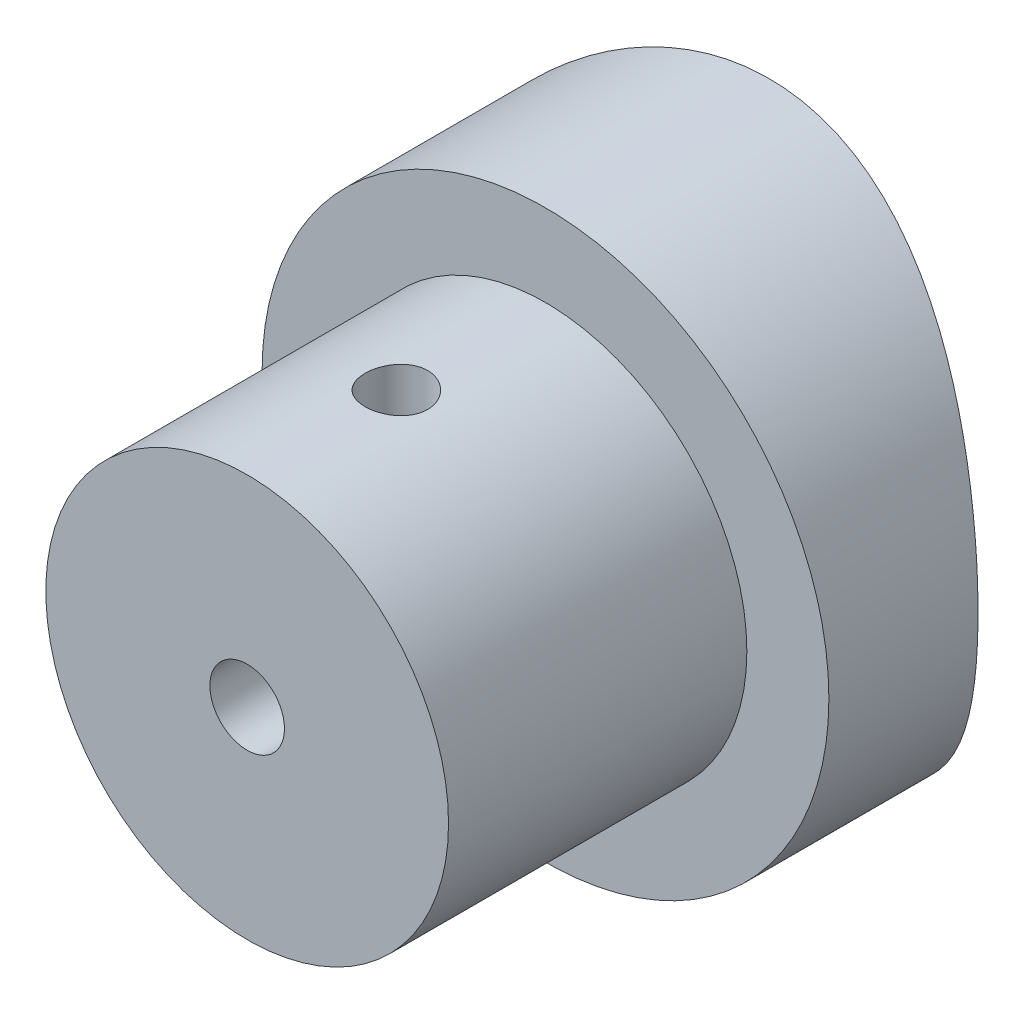
ISO-10303-21;
HEADER;
FILE_DESCRIPTION(('STEP AP214'),'2;1');
FILE_NAME('part.step','',(''),(''),'','','');
FILE_SCHEMA(('AUTOMOTIVE_DESIGN { 1 0 10303 214 1 1 1 1 }'));
ENDSEC;
DATA;
#1=APPLICATION_CONTEXT('core data for automotive mechanical design processes');
#2=APPLICATION_PROTOCOL_DEFINITION('international standard','automotive_design',2000,#1);
#3=PRODUCT_CONTEXT('',#1,'mechanical');
#4=PRODUCT('Part','Part','',(#3));
#5=PRODUCT_RELATED_PRODUCT_CATEGORY('part','',(#4));
#6=PRODUCT_DEFINITION_FORMATION('','',#4);
#7=PRODUCT_DEFINITION_CONTEXT('part definition',#1,'design');
#8=PRODUCT_DEFINITION('design','',#6,#7);
#9=PRODUCT_DEFINITION_SHAPE('','',#8);
#10=(LENGTH_UNIT() NAMED_UNIT(*) SI_UNIT(.MILLI.,.METRE.));
#11=(NAMED_UNIT(*) PLANE_ANGLE_UNIT() SI_UNIT($,.RADIAN.));
#12=(NAMED_UNIT(*) SI_UNIT($,.STERADIAN.) SOLID_ANGLE_UNIT());
#13=UNCERTAINTY_MEASURE_WITH_UNIT(LENGTH_MEASURE(1.E-05),#10,'distance_accuracy_value','');
#14=(GEOMETRIC_REPRESENTATION_CONTEXT(3) GLOBAL_UNCERTAINTY_ASSIGNED_CONTEXT((#13)) GLOBAL_UNIT_ASSIGNED_CONTEXT((#10,
#11,#12)) REPRESENTATION_CONTEXT('',''));
#15=CARTESIAN_POINT('',(0.,0.,0.));
#16=DIRECTION('',(0.,0.,1.));
#17=DIRECTION('',(1.,0.,0.));
#18=AXIS2_PLACEMENT_3D('',#15,#16,#17);
#19=CARTESIAN_POINT('',(0.,69.7428311728166,31.1));
#20=DIRECTION('',(0.,-1.,0.));
#21=DIRECTION('',(0.,0.,-1.));
#22=AXIS2_PLACEMENT_3D('',#19,#20,#21);
#23=CYLINDRICAL_SURFACE('',#22,38.6);
#24=CARTESIAN_POINT('',(0.,-2.49999999999999,-7.5));
#25=CARTESIAN_POINT('',(-0.140268350995433,-2.49999383220252,-7.49999892520004));
#26=CARTESIAN_POINT('',(-0.280634658438698,-2.48815520124154,-7.49922724499388));
#27=CARTESIAN_POINT('',(-0.557490698350682,-2.44109889663341,-7.49622304850796));
#28=CARTESIAN_POINT('',(-0.693975738167183,-2.40585408061731,-7.49398883628434));
#29=CARTESIAN_POINT('',(-0.959018945517504,-2.31300262309516,-7.48831229925938));
#30=CARTESIAN_POINT('',(-1.08758128150655,-2.25540785923592,-7.48487061624882));
#31=CARTESIAN_POINT('',(-1.33318020589853,-2.11951086235299,-7.47716612340435));
#32=CARTESIAN_POINT('',(-1.45021940898904,-2.04121334187426,-7.47290350049995));
#33=CARTESIAN_POINT('',(-1.66967009231775,-1.86599660072953,-7.46402857217439));
#34=CARTESIAN_POINT('',(-1.77206071797939,-1.76905128306409,-7.45941578224761));
#35=CARTESIAN_POINT('',(-1.95912933290885,-1.55934484784059,-7.45036453665432));
#36=CARTESIAN_POINT('',(-2.04380657854319,-1.44658306661619,-7.44592608831328));
#37=CARTESIAN_POINT('',(-2.19310989183877,-1.20832537569032,-7.4377202892716));
#38=CARTESIAN_POINT('',(-2.25771849701785,-1.08281850128485,-7.4339535242349));
#39=CARTESIAN_POINT('',(-2.36493881912756,-0.822710122876562,-7.42752219068116));
#40=CARTESIAN_POINT('',(-2.40755078696447,-0.688108722630936,-7.42485760959205));
#41=CARTESIAN_POINT('',(-2.46950999180144,-0.413834197839927,-7.42093577416735));
#42=CARTESIAN_POINT('',(-2.48889008546047,-0.274168524560313,-7.41967653244571));
#43=CARTESIAN_POINT('',(-2.50393684807067,0.00643878804310917,-7.41870143104577));
#44=CARTESIAN_POINT('',(-2.49960380231608,0.147380411995509,-7.41898555279916));
#45=CARTESIAN_POINT('',(-2.46737453882833,0.426314805289925,-7.42106329309267));
#46=CARTESIAN_POINT('',(-2.43951389089697,0.564311703850782,-7.42285463295602));
#47=CARTESIAN_POINT('',(-2.36107546470338,0.833666063819643,-7.42774135349354));
#48=CARTESIAN_POINT('',(-2.31049754212894,0.965023483044247,-7.43083674245172));
#49=CARTESIAN_POINT('',(-2.18801996098409,1.21748431436672,-7.43798535992502));
#50=CARTESIAN_POINT('',(-2.116104183773,1.33857988542834,-7.44203931206809));
#51=CARTESIAN_POINT('',(-1.95300399295756,1.5669938352122,-7.4506474919613));
#52=CARTESIAN_POINT('',(-1.86181934620853,1.67431204720932,-7.45520172576431));
#53=CARTESIAN_POINT('',(-1.66256955805515,1.87233184767827,-7.46430736757322));
#54=CARTESIAN_POINT('',(-1.55447363623248,1.96300246838422,-7.46885875492647));
#55=CARTESIAN_POINT('',(-1.32457760144405,2.12491435694789,-7.47743774711103));
#56=CARTESIAN_POINT('',(-1.2027774833525,2.1961556175384,-7.48146535174643));
#57=CARTESIAN_POINT('',(-0.948911605150716,2.31718395160993,-7.48854329192537));
#58=CARTESIAN_POINT('',(-0.816845275270246,2.36696983332197,-7.49159357317971));
#59=CARTESIAN_POINT('',(-0.546204323330071,2.44365338948084,-7.49637243055961));
#60=CARTESIAN_POINT('',(-0.407629782903275,2.47055135093149,-7.4981010232585));
#61=CARTESIAN_POINT('',(-0.128174695236377,2.50065711637958,-7.50003958674379));
#62=CARTESIAN_POINT('',(0.0127012216761573,2.50390773220617,-7.50025230190389));
#63=CARTESIAN_POINT('',(0.292996287447899,2.48673842164177,-7.49914244334657));
#64=CARTESIAN_POINT('',(0.432415444451875,2.46631862766398,-7.49781987821758));
#65=CARTESIAN_POINT('',(0.705718646916924,2.40242359222022,-7.49379009841515));
#66=CARTESIAN_POINT('',(0.839607307823981,2.35896801202578,-7.49108406461584));
#67=CARTESIAN_POINT('',(1.09819141361173,2.25025492847206,-7.48459174143015));
#68=CARTESIAN_POINT('',(1.22288676974574,2.18499721468164,-7.48080544161725));
#69=CARTESIAN_POINT('',(1.45974055602722,2.03442344120528,-7.47257109318192));
#70=CARTESIAN_POINT('',(1.5718807897086,1.94907881045846,-7.46812210531106));
#71=CARTESIAN_POINT('',(1.78025785346923,1.76079538106365,-7.45906613936628));
#72=CARTESIAN_POINT('',(1.87649451568347,1.6578563967275,-7.45445915962534));
#73=CARTESIAN_POINT('',(2.05047782768692,1.43712151225251,-7.44559848172926));
#74=CARTESIAN_POINT('',(2.1281966874449,1.3193036834972,-7.44134532070488));
#75=CARTESIAN_POINT('',(2.26274810562211,1.07226563898588,-7.4336804908179));
#76=CARTESIAN_POINT('',(2.31958080053778,0.943045497753765,-7.43026881645603));
#77=CARTESIAN_POINT('',(2.41069856941945,0.676972123861952,-7.42467558726359));
#78=CARTESIAN_POINT('',(2.44500108876567,0.540124886242921,-7.42249308086091));
#79=CARTESIAN_POINT('',(2.49014174315989,0.262598745217303,-7.41960168077821));
#80=CARTESIAN_POINT('',(2.50098013162315,0.121919883209311,-7.41889277118319));
#81=CARTESIAN_POINT('',(2.49888238069703,-0.158999844481102,-7.41902889640173));
#82=CARTESIAN_POINT('',(2.48598992824462,-0.299241039866489,-7.41987107576293));
#83=CARTESIAN_POINT('',(2.43688708999069,-0.57556286006258,-7.42300842578959));
#84=CARTESIAN_POINT('',(2.40067666246159,-0.711643477427462,-7.42530359905518));
#85=CARTESIAN_POINT('',(2.30597572122747,-0.975787510526448,-7.43108759167895));
#86=CARTESIAN_POINT('',(2.2474854501219,-1.10385101353917,-7.43457639803992));
#87=CARTESIAN_POINT('',(2.1098909988539,-1.34834605886727,-7.44235446013083));
#88=CARTESIAN_POINT('',(2.03078733251952,-1.4647778910241,-7.44664369590777));
#89=CARTESIAN_POINT('',(1.85404958396336,-1.682926382532,-7.45554850431249));
#90=CARTESIAN_POINT('',(1.75638380185681,-1.78461733634285,-7.46016462660137));
#91=CARTESIAN_POINT('',(1.54533899660703,-1.97019644889286,-7.4691983070493));
#92=CARTESIAN_POINT('',(1.43195613899488,-2.05408025057011,-7.47361581640373));
#93=CARTESIAN_POINT('',(1.19255827871832,-2.20173038030984,-7.48175939537372));
#94=CARTESIAN_POINT('',(1.06652710453428,-2.26547051056245,-7.4854845619935));
#95=CARTESIAN_POINT('',(0.805618678994864,-2.37080711725964,-7.49181177789041));
#96=CARTESIAN_POINT('',(0.670751978214845,-2.41242948223302,-7.494415139546));
#97=CARTESIAN_POINT('',(0.445885748600733,-2.4615516772024,-7.49752450282889));
#98=CARTESIAN_POINT('',(0.357339084873304,-2.47595110544052,-7.4984486791611));
#99=CARTESIAN_POINT('',(0.179208276769942,-2.49517723013015,-7.49968677066072));
#100=CARTESIAN_POINT('',(0.0896241339459837,-2.50000394089973,-7.50000068674091));
#101=CARTESIAN_POINT('',(0.,-2.49999999999999,-7.5));
#102=B_SPLINE_CURVE_WITH_KNOTS('',3,(#24,#25,#26,#27,#28,#29,#30,#31,#32,#33,#34,#35,#36,#37,
#38,#39,#40,#41,#42,#43,#44,#45,#46,#47,#48,#49,#50,#51,#52,#53,#54,#55,#56,#57,#58,#59,#60,#61,
#62,#63,#64,#65,#66,#67,#68,#69,#70,#71,#72,#73,#74,#75,#76,#77,#78,#79,#80,#81,#82,#83,#84,#85,
#86,#87,#88,#89,#90,#91,#92,#93,#94,#95,#96,#97,#98,#99,#100,#101),.UNSPECIFIED.,.T.,.F.,(4,2,2,
2,2,2,2,2,2,2,2,2,2,2,2,2,2,2,2,2,2,2,2,2,2,2,2,2,2,2,2,2,2,2,2,2,2,2,4),(0.,0.420477867518121,
0.841444184580872,1.26218708918855,1.68283430289442,2.10407453922795,2.52533245629264,
2.94695590555238,3.36857454542684,3.78959618716171,4.21061276357055,4.63099397045335,
5.05137784785893,5.47208009575899,5.89278743425898,6.31426961226809,6.73575194792515,
7.15725769239037,7.5787581512928,7.99949532339209,8.42023014188268,8.84060643586399,
9.26098678737586,9.68196872855898,10.1029551129968,10.5245693558558,10.9461808433086,
11.3674654859497,11.788745578646,12.2092508975848,12.629756969021,13.0502584618059,
13.4707494737942,13.8919651487637,14.3132837684816,14.7351480995382,15.156517550652,
15.4251812999471,15.6938446473974),.UNSPECIFIED.);
#103=CARTESIAN_POINT('',(0.,-2.49999999999999,-7.5));
#104=VERTEX_POINT('',#103);
#105=EDGE_CURVE('E11',#104,#104,#102,.T.);
#106=ORIENTED_EDGE('',*,*,#105,.F.);
#107=EDGE_LOOP('',(#106));
#108=FACE_BOUND('',#107,.T.);
#109=CARTESIAN_POINT('',(-19.,0.,-2.5));
#110=CARTESIAN_POINT('',(-18.9999972988286,0.496448361452962,-2.50000348187251));
#111=CARTESIAN_POINT('',(-18.9805162640856,0.992954018408887,-2.51104049557021));
#112=CARTESIAN_POINT('',(-18.9028399807994,1.98216274340463,-2.55478529828168));
#113=CARTESIAN_POINT('',(-18.8446259558488,2.4748638498894,-2.58750359759802));
#114=CARTESIAN_POINT('',(-18.690102859312,3.4533849354667,-2.67347870114112));
#115=CARTESIAN_POINT('',(-18.5937216209179,3.93919006260471,-2.7267744084586));
#116=CARTESIAN_POINT('',(-18.3640694998429,4.8994566363873,-2.85199568578589));
#117=CARTESIAN_POINT('',(-18.2308023774109,5.3739192339674,-2.92391935676168));
#118=CARTESIAN_POINT('',(-17.9296236225164,6.30613204158346,-3.08358457593337));
#119=CARTESIAN_POINT('',(-17.7618965893354,6.7639566022697,-3.17124153816483));
#120=CARTESIAN_POINT('',(-17.392938668315,7.66301667727951,-3.35995631267655));
#121=CARTESIAN_POINT('',(-17.1917070306881,8.10425182008356,-3.46101442484598));
#122=CARTESIAN_POINT('',(-16.7573835683014,8.96792576538307,-3.67367564816138));
#123=CARTESIAN_POINT('',(-16.5242999448854,9.3903693693859,-3.78527604257293));
#124=CARTESIAN_POINT('',(-16.0276884936334,10.2149372782261,-4.01621000383211));
#125=CARTESIAN_POINT('',(-15.7641494892931,10.617054045216,-4.13554640253698));
#126=CARTESIAN_POINT('',(-15.1860029354186,11.4303839925788,-4.3887679788222));
#127=CARTESIAN_POINT('',(-14.8689997379427,11.839770853787,-4.52305490053944));
#128=CARTESIAN_POINT('',(-14.2030534840581,12.6309406491447,-4.79376634776443));
#129=CARTESIAN_POINT('',(-13.8541088097251,13.0127221832527,-4.9301909812628));
#130=CARTESIAN_POINT('',(-13.1257848012662,13.7470487579641,-5.2018582152536));
#131=CARTESIAN_POINT('',(-12.7463861443767,14.0995749432152,-5.33710000393044));
#132=CARTESIAN_POINT('',(-11.9592763349847,14.7730806582918,-5.60297274335491));
#133=CARTESIAN_POINT('',(-11.5515747671016,15.0940707795458,-5.73360523263054));
#134=CARTESIAN_POINT('',(-10.682196606362,15.7224921580973,-5.99541628771333));
#135=CARTESIAN_POINT('',(-10.2187340142245,16.0276759636509,-6.12607546939157));
#136=CARTESIAN_POINT('',(-9.26435254722998,16.5976108249387,-6.37499104264836));
#137=CARTESIAN_POINT('',(-8.77343215663023,16.8623596455398,-6.49324674848429));
#138=CARTESIAN_POINT('',(-7.76750538099187,17.3487114511387,-6.71389738038152));
#139=CARTESIAN_POINT('',(-7.25251047658082,17.5703347466527,-6.81629976809761));
#140=CARTESIAN_POINT('',(-6.20194438670952,17.9680620144561,-7.00223510569464));
#141=CARTESIAN_POINT('',(-5.66637531490723,18.1441706483413,-7.08576998786838));
#142=CARTESIAN_POINT('',(-4.61667732296933,18.4380703305929,-7.22632229537957));
#143=CARTESIAN_POINT('',(-4.1036346194131,18.5590569981206,-7.28477619201511));
#144=CARTESIAN_POINT('',(-3.06741092247632,18.7581790442362,-7.38144594647147));
#145=CARTESIAN_POINT('',(-2.54423035948746,18.8363162378429,-7.41966266149681));
#146=CARTESIAN_POINT('',(-1.49231492904755,18.9486847840593,-7.47473598299682));
#147=CARTESIAN_POINT('',(-0.963582924111803,18.9829377422069,-7.49160310047549));
#148=CARTESIAN_POINT('',(0.0951269469442023,19.0071370697903,-7.50351192776305));
#149=CARTESIAN_POINT('',(0.625104738074959,18.9970860411106,-7.49855491925925));
#150=CARTESIAN_POINT('',(1.6370445902532,18.9355472129155,-7.46830746979498));
#151=CARTESIAN_POINT('',(2.11928143096851,18.8876309002078,-7.44476977007419));
#152=CARTESIAN_POINT('',(3.07750151171802,18.7553425085187,-7.38011872092556));
#153=CARTESIAN_POINT('',(3.55348517575845,18.6709729145918,-7.33900656956674));
#154=CARTESIAN_POINT('',(4.49600198766404,18.4666866297256,-7.24019475790106));
#155=CARTESIAN_POINT('',(4.96253482799945,18.3467687840249,-7.18249455874435));
#156=CARTESIAN_POINT('',(5.88320454467369,18.0725933391869,-7.05185594848939));
#157=CARTESIAN_POINT('',(6.33734098155525,17.9183345244194,-6.9789169979627));
#158=CARTESIAN_POINT('',(7.23687145145491,17.5744929551726,-6.81832504489628));
#159=CARTESIAN_POINT('',(7.68205235748299,17.3844434165173,-6.73047932660702));
#160=CARTESIAN_POINT('',(8.55456145764598,16.9721043119501,-6.54277667721627));
#161=CARTESIAN_POINT('',(8.9818896649646,16.7498147698471,-6.44291975498494));
#162=CARTESIAN_POINT('',(9.81674083632854,16.2745927389584,-6.23332141234461));
#163=CARTESIAN_POINT('',(10.2242588687265,16.0216526740572,-6.12357754983443));
#164=CARTESIAN_POINT('',(11.0176164661003,15.486802258969,-5.89651900271732));
#165=CARTESIAN_POINT('',(11.403454087696,15.20488931811,-5.77920364143805));
#166=CARTESIAN_POINT('',(12.1864307551078,14.5863723419745,-5.52833778485434));
#167=CARTESIAN_POINT('',(12.5813220688888,14.2471218503358,-5.39428857355192));
#168=CARTESIAN_POINT('',(13.3414602113369,13.5379345443547,-5.12331148899607));
#169=CARTESIAN_POINT('',(13.7067053788996,13.1679960128745,-4.98638345497967));
#170=CARTESIAN_POINT('',(14.4059333870053,12.3991614682866,-4.71298748562941));
#171=CARTESIAN_POINT('',(14.7399015098811,12.0002519778556,-4.57651979574071));
#172=CARTESIAN_POINT('',(15.374750030668,11.1753335090368,-4.30756958186006));
#173=CARTESIAN_POINT('',(15.675614765235,10.7493118513343,-4.17508896576349));
#174=CARTESIAN_POINT('',(16.2593466818926,9.84581440353876,-3.91003458251586));
#175=CARTESIAN_POINT('',(16.5400326582617,9.36678498014818,-3.77793748984979));
#176=CARTESIAN_POINT('',(17.0594668512306,8.3835286178314,-3.52683668213713));
#177=CARTESIAN_POINT('',(17.2982371586494,7.87931513274639,-3.4078260825466));
#178=CARTESIAN_POINT('',(17.7314956888308,6.84881498495566,-3.18721601054111));
#179=CARTESIAN_POINT('',(17.9260075468581,6.32254028223704,-3.08560725225457));
#180=CARTESIAN_POINT('',(18.2685000204716,5.2514660245774,-2.90381730889042));
#181=CARTESIAN_POINT('',(18.4164867729357,4.7066689233411,-2.82363329799851));
#182=CARTESIAN_POINT('',(18.6541083487053,3.64635063011618,-2.69350707396204));
#183=CARTESIAN_POINT('',(18.7474067839376,3.13188032861155,-2.64168754890202));
#184=CARTESIAN_POINT('',(18.8913716183277,2.09519919949256,-2.56129725461446));
#185=CARTESIAN_POINT('',(18.9420403780059,1.57298880209794,-2.53272519811455));
#186=CARTESIAN_POINT('',(18.9999618084182,0.525694155927355,-2.5000381697267));
#187=CARTESIAN_POINT('',(19.0072389210813,0.000611691830475474,-2.49590942925811));
#188=CARTESIAN_POINT('',(18.9783252154395,-1.04794985870137,-2.51225166284277));
#189=CARTESIAN_POINT('',(18.942137120738,-1.57142904353993,-2.53272109553293));
#190=CARTESIAN_POINT('',(18.8329031708335,-2.55765152481259,-2.59399280005669));
#191=CARTESIAN_POINT('',(18.7641079612003,-3.02102100174755,-2.63244463881781));
#192=CARTESIAN_POINT('',(18.5929449115985,-3.93962556757052,-2.72708911228626));
#193=CARTESIAN_POINT('',(18.4905799054125,-4.39486133964319,-2.78328024952197));
#194=CARTESIAN_POINT('',(18.2533342025038,-5.2945543319274,-2.91167373097365));
#195=CARTESIAN_POINT('',(18.1184459198572,-5.73900901083425,-2.98387981029535));
#196=CARTESIAN_POINT('',(17.8174264900468,-6.61465741427259,-3.14219920893036));
#197=CARTESIAN_POINT('',(17.6512934771344,-7.04585034510168,-3.22831335870718));
#198=CARTESIAN_POINT('',(17.2807720550124,-7.91246673746995,-3.41637331726743));
#199=CARTESIAN_POINT('',(17.0749722017913,-8.34716739739005,-3.51886627748024));
#200=CARTESIAN_POINT('',(16.632111227745,-9.19798939133508,-3.73379765034556));
#201=CARTESIAN_POINT('',(16.3950366924561,-9.61410264967207,-3.84624032381704));
#202=CARTESIAN_POINT('',(15.8911378837611,-10.4259305650215,-4.0782413590945));
#203=CARTESIAN_POINT('',(15.6243076372919,-10.8216411030621,-4.19780114731293));
#204=CARTESIAN_POINT('',(15.0623573157469,-11.5910471351682,-4.44123183637792));
#205=CARTESIAN_POINT('',(14.7672353037493,-11.9647411190961,-4.56510303202341));
#206=CARTESIAN_POINT('',(14.1125583724461,-12.7326444007577,-4.82958351782332));
#207=CARTESIAN_POINT('',(13.749531475322,-13.1238301747853,-4.97039795058319));
#208=CARTESIAN_POINT('',(12.9915139651604,-13.8746232763655,-5.25029307588013));
#209=CARTESIAN_POINT('',(12.5965209598985,-14.2342282363208,-5.38937363776028));
#210=CARTESIAN_POINT('',(11.7764180211408,-14.9198425847306,-5.6622464496166));
#211=CARTESIAN_POINT('',(11.3512984223253,-15.2458411083576,-5.79603698078295));
#212=CARTESIAN_POINT('',(10.4732198852847,-15.8618814158205,-6.05482662418321));
#213=CARTESIAN_POINT('',(10.020261271788,-16.1519236189502,-6.17982583892705));
#214=CARTESIAN_POINT('',(9.07799688541491,-16.7001188419445,-6.42055290481837));
#215=CARTESIAN_POINT('',(8.58808701281973,-16.9573620245123,-6.53599375970282));
#216=CARTESIAN_POINT('',(7.5847537883516,-17.429251946892,-6.75095359159463));
#217=CARTESIAN_POINT('',(7.07132971175092,-17.643897372716,-6.85047207743571));
#218=CARTESIAN_POINT('',(6.02501900515933,-18.028019459266,-7.03057451417136));
#219=CARTESIAN_POINT('',(5.49214616098774,-18.1975274338414,-7.11117158706946));
#220=CARTESIAN_POINT('',(4.41091436767424,-18.4893829319573,-7.25102138177346));
#221=CARTESIAN_POINT('',(3.86255719296137,-18.6117358358898,-7.31027653864074));
#222=CARTESIAN_POINT('',(2.80504504616434,-18.7987657170011,-7.40126718875482));
#223=CARTESIAN_POINT('',(2.29680066940297,-18.8676407306412,-7.43499866315893));
#224=CARTESIAN_POINT('',(1.27548188108081,-18.9640760872123,-7.48230677076361));
#225=CARTESIAN_POINT('',(0.762407772728577,-18.9916390065214,-7.49588466081717));
#226=CARTESIAN_POINT('',(-0.264270287278098,-19.0050958407832,-7.50250819198089));
#227=CARTESIAN_POINT('',(-0.777874049831106,-18.9910014474072,-7.49555959411942));
#228=CARTESIAN_POINT('',(-1.80156972464464,-18.9213510226695,-7.46133555994744));
#229=CARTESIAN_POINT('',(-2.31166172369334,-18.8657960196862,-7.43406062780614));
#230=CARTESIAN_POINT('',(-3.29249949372278,-18.7187007889037,-7.36226641551169));
#231=CARTESIAN_POINT('',(-3.76370678615572,-18.6296355296691,-7.31893572219932));
#232=CARTESIAN_POINT('',(-4.69634254755411,-18.4166539643184,-7.2161121064975));
#233=CARTESIAN_POINT('',(-5.15777154111406,-18.2927395329364,-7.15662005352484));
#234=CARTESIAN_POINT('',(-6.06806530690064,-18.0112628234406,-7.02283128722932));
#235=CARTESIAN_POINT('',(-6.51692904785314,-17.8536977926093,-6.94853336277613));
#236=CARTESIAN_POINT('',(-7.39955093247973,-17.5063302752475,-6.7867784819824));
#237=CARTESIAN_POINT('',(-7.83330837518665,-17.3165262951506,-6.69932091600324));
#238=CARTESIAN_POINT('',(-8.70202190763567,-16.8972614955853,-6.50905535183913));
#239=CARTESIAN_POINT('',(-9.13620791353709,-16.6664338440667,-6.4057447950286));
#240=CARTESIAN_POINT('',(-9.98355543790966,-16.1730949190873,-6.18913904996768));
#241=CARTESIAN_POINT('',(-10.3967165448559,-15.9105830258029,-6.07584366640059));
#242=CARTESIAN_POINT('',(-11.2002881152336,-15.3555230596263,-5.84169400127501));
#243=CARTESIAN_POINT('',(-11.5906905841808,-15.0629645306573,-5.72083709410153));
#244=CARTESIAN_POINT('',(-12.3469615764399,-14.449554999935,-5.47418187207852));
#245=CARTESIAN_POINT('',(-12.712827948488,-14.1287015230457,-5.34838312547024));
#246=CARTESIAN_POINT('',(-13.4526731046948,-13.4279449682274,-5.08224312058001));
#247=CARTESIAN_POINT('',(-13.824007886976,-13.0453324133455,-4.94167307240552));
#248=CARTESIAN_POINT('',(-14.5334161002356,-12.2500526363835,-4.66150586011593));
#249=CARTESIAN_POINT('',(-14.8714871152586,-11.8373832350498,-4.52190876734998));
#250=CARTESIAN_POINT('',(-15.5127183148252,-10.9836610130387,-4.24738079161482));
#251=CARTESIAN_POINT('',(-15.8158472166404,-10.5425833013587,-4.11245416443936));
#252=CARTESIAN_POINT('',(-16.3848127231314,-9.6345696059948,-3.85133635071888));
#253=CARTESIAN_POINT('',(-16.6506523131311,-9.16763569649672,-3.72514446529436));
#254=CARTESIAN_POINT('',(-17.1496340563281,-8.1972959810235,-3.48220888334076));
#255=CARTESIAN_POINT('',(-17.3816944450305,-7.69324460602749,-3.36581405754902));
#256=CARTESIAN_POINT('',(-17.8019289711321,-6.66337906731403,-3.15065153358165));
#257=CARTESIAN_POINT('',(-17.9900957854407,-6.13756128935188,-3.05188677740566));
#258=CARTESIAN_POINT('',(-18.3196699099713,-5.06962024232789,-2.87623454651629));
#259=CARTESIAN_POINT('',(-18.4612136245196,-4.52754969346932,-2.79928334606327));
#260=CARTESIAN_POINT('',(-18.6961568498525,-3.43045381597222,-2.67028011883663));
#261=CARTESIAN_POINT('',(-18.7895903894104,-2.87543793493879,-2.61821049497441));
#262=CARTESIAN_POINT('',(-18.9053747961527,-1.93295615317794,-2.55337368828295));
#263=CARTESIAN_POINT('',(-18.9408289995601,-1.54753723308267,-2.53340176400918));
#264=CARTESIAN_POINT('',(-18.9881434135439,-0.774757253645456,-2.5067131354212));
#265=CARTESIAN_POINT('',(-19.0000021078188,-0.387396071092768,-2.49999728297274));
#266=CARTESIAN_POINT('',(-19.,0.,-2.5));
#267=B_SPLINE_CURVE_WITH_KNOTS('',3,(#109,#110,#111,#112,#113,#114,#115,#116,#117,#118,#119,
#120,#121,#122,#123,#124,#125,#126,#127,#128,#129,#130,#131,#132,#133,#134,#135,#136,#137,#138,
#139,#140,#141,#142,#143,#144,#145,#146,#147,#148,#149,#150,#151,#152,#153,#154,#155,#156,#157,
#158,#159,#160,#161,#162,#163,#164,#165,#166,#167,#168,#169,#170,#171,#172,#173,#174,#175,#176,
#177,#178,#179,#180,#181,#182,#183,#184,#185,#186,#187,#188,#189,#190,#191,#192,#193,#194,#195,
#196,#197,#198,#199,#200,#201,#202,#203,#204,#205,#206,#207,#208,#209,#210,#211,#212,#213,#214,
#215,#216,#217,#218,#219,#220,#221,#222,#223,#224,#225,#226,#227,#228,#229,#230,#231,#232,#233,
#234,#235,#236,#237,#238,#239,#240,#241,#242,#243,#244,#245,#246,#247,#248,#249,#250,#251,#252,
#253,#254,#255,#256,#257,#258,#259,#260,#261,#262,#263,#264,#265,#266),.UNSPECIFIED.,.T.,.F.,(4,
2,2,2,2,2,2,2,2,2,2,2,2,2,2,2,2,2,2,2,2,2,2,2,2,2,2,2,2,2,2,2,2,2,2,2,2,2,2,2,2,2,2,2,2,2,2,2,2,
2,2,2,2,2,2,2,2,2,2,2,2,2,2,2,2,2,2,2,2,2,2,2,2,2,2,2,2,2,4),(0.,1.48894471441774,
2.9786117438749,4.47110899798662,5.96345415881231,7.44800415837199,8.93258738460558,
10.416789073666,11.9015371745858,13.5045392606505,15.1076225881947,16.7117312213408,
18.3152992574939,20.023387283998,21.7315696946948,23.4389456575834,25.1461466822561,
26.7350401642598,28.3238663386874,29.9119099849105,31.4998603697475,32.9536910582654,
34.4074226534034,35.8612014772201,37.3150317712999,38.7893322005083,40.2636315409686,
41.7382960410519,43.2130925163517,44.8241059663006,46.4352096207839,48.0470676235554,
49.6596850497184,51.369602178099,53.0786154053657,54.7867138179018,56.4945868296837,
58.0686388650494,59.6426037351551,61.2156819282767,62.7886615548013,64.1971293189708,
65.6054782184182,67.014155927913,68.4229177819505,69.8966811696298,71.3710787577913,
72.8457728462287,74.3205679679422,75.9745416815699,77.6286392870803,79.2832699896658,
80.9378813954601,82.6313858260358,84.324942487029,86.0173211736221,87.7095067026539,
89.2494780318796,90.7893533186911,92.328796460349,93.868201419324,95.3110752170524,
96.7538714092818,98.1967856717,99.6397667997097,101.145574743744,102.651412149957,
104.157775367035,105.664270486079,107.316619014205,108.96908746435,110.623024019705,
112.276828087835,113.975465296473,115.674385698992,117.368290515824,119.060995566561,
120.222796699541,121.38467249011),.UNSPECIFIED.);
#268=CARTESIAN_POINT('',(-19.,0.,-2.5));
#269=VERTEX_POINT('',#268);
#270=EDGE_CURVE('E71',#269,#269,#267,.T.);
#271=ORIENTED_EDGE('',*,*,#270,.T.);
#272=EDGE_LOOP('',(#271));
#273=FACE_BOUND('',#272,.T.);
#274=ADVANCED_FACE('F36',(#108,#273),#23,.T.);
#275=CARTESIAN_POINT('',(0.,0.,7.5));
#276=DIRECTION('',(0.,0.,-1.));
#277=DIRECTION('',(-1.,0.,0.));
#278=AXIS2_PLACEMENT_3D('',#275,#276,#277);
#279=CYLINDRICAL_SURFACE('',#278,19.);
#280=CARTESIAN_POINT('',(0.,0.,7.5));
#281=DIRECTION('',(0.,0.,1.));
#282=DIRECTION('',(1.,0.,0.));
#283=AXIS2_PLACEMENT_3D('',#280,#281,#282);
#284=CIRCLE('',#283,19.);
#285=CARTESIAN_POINT('',(19.,0.,7.5));
#286=VERTEX_POINT('',#285);
#287=EDGE_CURVE('E74',#286,#286,#284,.T.);
#288=ORIENTED_EDGE('',*,*,#287,.F.);
#289=EDGE_LOOP('',(#288));
#290=FACE_BOUND('',#289,.T.);
#291=ORIENTED_EDGE('',*,*,#270,.F.);
#292=EDGE_LOOP('',(#291));
#293=FACE_BOUND('',#292,.T.);
#294=ADVANCED_FACE('F38',(#290,#293),#279,.T.);
#295=CARTESIAN_POINT('',(0.,0.,7.5));
#296=DIRECTION('',(0.,0.,1.));
#297=DIRECTION('',(1.,0.,0.));
#298=AXIS2_PLACEMENT_3D('',#295,#296,#297);
#299=PLANE('',#298);
#300=CARTESIAN_POINT('',(0.,0.,7.5));
#301=DIRECTION('',(0.,0.,1.));
#302=DIRECTION('',(1.,0.,0.));
#303=AXIS2_PLACEMENT_3D('',#300,#301,#302);
#304=CIRCLE('',#303,13.5);
#305=CARTESIAN_POINT('',(13.5,0.,7.5));
#306=VERTEX_POINT('',#305);
#307=EDGE_CURVE('E50',#306,#306,#304,.T.);
#308=ORIENTED_EDGE('',*,*,#307,.F.);
#309=EDGE_LOOP('',(#308));
#310=FACE_BOUND('',#309,.T.);
#311=ORIENTED_EDGE('',*,*,#287,.T.);
#312=EDGE_LOOP('',(#311));
#313=FACE_BOUND('',#312,.T.);
#314=ADVANCED_FACE('F87',(#310,#313),#299,.T.);
#315=CARTESIAN_POINT('',(0.,0.,27.5));
#316=DIRECTION('',(0.,0.,-1.));
#317=DIRECTION('',(-1.,0.,0.));
#318=AXIS2_PLACEMENT_3D('',#315,#316,#317);
#319=CYLINDRICAL_SURFACE('',#318,13.5);
#320=CARTESIAN_POINT('',(0.,13.5,19.6));
#321=CARTESIAN_POINT('',(-0.11719940623624,13.4999980751182,19.599995207807));
#322=CARTESIAN_POINT('',(-0.23446551867635,13.4984578477386,19.5901556557009));
#323=CARTESIAN_POINT('',(-0.465716377680878,13.4924618361036,19.5510694468523));
#324=CARTESIAN_POINT('',(-0.579697877516676,13.4880032638491,19.5218042317018));
#325=CARTESIAN_POINT('',(-0.800999686247604,13.4766712982379,19.4447653506721));
#326=CARTESIAN_POINT('',(-0.908325089015662,13.4697997790121,19.3970060461623));
#327=CARTESIAN_POINT('',(-1.11342312516664,13.4544000077011,19.2843706199514));
#328=CARTESIAN_POINT('',(-1.21119700716967,13.4458719726003,19.2194967396629));
#329=CARTESIAN_POINT('',(-1.39525105409055,13.4280266873277,19.0738950162654));
#330=CARTESIAN_POINT('',(-1.48143961392734,13.4187040027244,18.9930520296387));
#331=CARTESIAN_POINT('',(-1.63908577971809,13.4003623732785,18.8180547395415));
#332=CARTESIAN_POINT('',(-1.71054251256324,13.3913434464651,18.7238996476618));
#333=CARTESIAN_POINT('',(-1.83705666661216,13.3745778031371,18.5243308653607));
#334=CARTESIAN_POINT('',(-1.89202481939525,13.3668381101729,18.4188599430025));
#335=CARTESIAN_POINT('',(-1.98343087183964,13.3535818566449,18.2000419025474));
#336=CARTESIAN_POINT('',(-2.01986985864736,13.3480651656567,18.0866952469805));
#337=CARTESIAN_POINT('',(-2.07289736351146,13.3399331930212,17.856309195094));
#338=CARTESIAN_POINT('',(-2.08964315100885,13.3372949366872,17.7393068230915));
#339=CARTESIAN_POINT('',(-2.10329624450922,13.3351488820051,17.5041253557925));
#340=CARTESIAN_POINT('',(-2.100204774495,13.3356408905159,17.3859463335461));
#341=CARTESIAN_POINT('',(-2.07439949524413,13.3396787760128,17.1528809562512));
#342=CARTESIAN_POINT('',(-2.05186132939982,13.3431973163566,17.0379746116938));
#343=CARTESIAN_POINT('',(-1.98807760943561,13.3528490836746,16.8135945586263));
#344=CARTESIAN_POINT('',(-1.94683148968727,13.358982389705,16.7041210144861));
#345=CARTESIAN_POINT('',(-1.84662149483731,13.3732026012318,16.4931824769475));
#346=CARTESIAN_POINT('',(-1.7875836937212,13.3812976298262,16.3917531734485));
#347=CARTESIAN_POINT('',(-1.65351879799797,13.3985233861723,16.2001742276106));
#348=CARTESIAN_POINT('',(-1.57849057613186,13.4076541869204,16.1100253812092));
#349=CARTESIAN_POINT('',(-1.41361277977413,13.4260432465402,15.9425487814626));
#350=CARTESIAN_POINT('',(-1.3236122923715,13.435301819082,15.8653695563833));
#351=CARTESIAN_POINT('',(-1.13185782145801,13.4528120330479,15.7271876311703));
#352=CARTESIAN_POINT('',(-1.03010377920829,13.4610636694393,15.666185011885));
#353=CARTESIAN_POINT('',(-0.817598368062624,13.4756398549653,15.5620784146809));
#354=CARTESIAN_POINT('',(-0.706841029048188,13.4819631119621,15.5189864310485));
#355=CARTESIAN_POINT('',(-0.479541264502166,13.4919594255068,15.4520562529831));
#356=CARTESIAN_POINT('',(-0.362999260538706,13.4956326748766,15.4282166576771));
#357=CARTESIAN_POINT('',(-0.128719710821348,13.4998894342712,15.4006667148758));
#358=CARTESIAN_POINT('',(-0.0110067145968205,13.5005042710971,15.3967522677659));
#359=CARTESIAN_POINT('',(0.223394216821688,13.4986603742943,15.4086212233598));
#360=CARTESIAN_POINT('',(0.340082186087566,13.49620174322,15.4244039688146));
#361=CARTESIAN_POINT('',(0.568498567014976,13.4885065426802,15.4750495587888));
#362=CARTESIAN_POINT('',(0.68024967380242,13.483284530404,15.5098124481925));
#363=CARTESIAN_POINT('',(0.896337481506001,13.4706460353863,15.5973257584867));
#364=CARTESIAN_POINT('',(1.00067381143803,13.4632294429389,15.6500770786292));
#365=CARTESIAN_POINT('',(1.19986430136335,13.4469476805652,15.7725449936065));
#366=CARTESIAN_POINT('',(1.2946383500142,13.4380716866495,15.8423904213027));
#367=CARTESIAN_POINT('',(1.47119272682179,13.419891349701,15.9968852226971));
#368=CARTESIAN_POINT('',(1.55297223894485,13.4105869798141,16.0815355254143));
#369=CARTESIAN_POINT('',(1.70196326604791,13.3924985810213,16.264148001789));
#370=CARTESIAN_POINT('',(1.76903760928719,13.3837199646442,16.3622227106605));
#371=CARTESIAN_POINT('',(1.88575938062865,13.3677745539096,16.5683669959038));
#372=CARTESIAN_POINT('',(1.93540730697213,13.3606077134718,16.6764362864073));
#373=CARTESIAN_POINT('',(2.01565670833047,13.3487369636966,16.8991012351088));
#374=CARTESIAN_POINT('',(2.04632910739132,13.3440238936035,17.0136708218859));
#375=CARTESIAN_POINT('',(2.08798172916518,13.3375703979585,17.2464143809427));
#376=CARTESIAN_POINT('',(2.09896342392432,13.3358297501935,17.3645880831127));
#377=CARTESIAN_POINT('',(2.10088593504857,13.3355268969142,17.599817347481));
#378=CARTESIAN_POINT('',(2.09204250083755,13.3369304738629,17.7168711590545));
#379=CARTESIAN_POINT('',(2.05502947311176,13.3426833552311,17.9478047340611));
#380=CARTESIAN_POINT('',(2.02685992018011,13.347032653465,18.0616845041588));
#381=CARTESIAN_POINT('',(1.95207265513278,13.3581746211827,18.2829699380958));
#382=CARTESIAN_POINT('',(1.9054711545785,13.3649651430458,18.3903811958218));
#383=CARTESIAN_POINT('',(1.79516450565629,13.3802268683742,18.595895650526));
#384=CARTESIAN_POINT('',(1.73145869052924,13.3886981373548,18.6939984844423));
#385=CARTESIAN_POINT('',(1.58797236261672,13.4064763859758,18.8792055373889));
#386=CARTESIAN_POINT('',(1.50803238715029,13.4157911039041,18.9661854877663));
#387=CARTESIAN_POINT('',(1.33468390363867,13.4341430502575,19.1255719558578));
#388=CARTESIAN_POINT('',(1.24127227758453,13.4431802138537,19.197975090452));
#389=CARTESIAN_POINT('',(1.04297620815983,13.4600205084056,19.3265403925149));
#390=CARTESIAN_POINT('',(0.938026851382446,13.4678159824769,19.3826034337048));
#391=CARTESIAN_POINT('',(0.720127011506084,13.4812197306887,19.4762209742681));
#392=CARTESIAN_POINT('',(0.607184849255257,13.4868302410113,19.5137944071089));
#393=CARTESIAN_POINT('',(0.411464407802887,13.4939692772192,19.5609603029045));
#394=CARTESIAN_POINT('',(0.329886810557724,13.4962190321568,19.5755774737431));
#395=CARTESIAN_POINT('',(0.165550560699333,13.4992350631421,19.5950989475546));
#396=CARTESIAN_POINT('',(0.0827919244897984,13.5000013597737,19.6000033852977));
#397=CARTESIAN_POINT('',(0.,13.5,19.6));
#398=B_SPLINE_CURVE_WITH_KNOTS('',3,(#320,#321,#322,#323,#324,#325,#326,#327,#328,#329,#330,
#331,#332,#333,#334,#335,#336,#337,#338,#339,#340,#341,#342,#343,#344,#345,#346,#347,#348,#349,
#350,#351,#352,#353,#354,#355,#356,#357,#358,#359,#360,#361,#362,#363,#364,#365,#366,#367,#368,
#369,#370,#371,#372,#373,#374,#375,#376,#377,#378,#379,#380,#381,#382,#383,#384,#385,#386,#387,
#388,#389,#390,#391,#392,#393,#394,#395,#396,#397),.UNSPECIFIED.,.T.,.F.,(4,2,2,2,2,2,2,2,2,2,2,
2,2,2,2,2,2,2,2,2,2,2,2,2,2,2,2,2,2,2,2,2,2,2,2,2,2,2,4),(0.,0.351295656995762,
0.702927410086199,1.05428665344363,1.40559990381681,1.75954535838937,2.113511784163,
2.46936134609431,2.82519002714925,3.17815734419035,3.53110288293012,3.88089358004176,
4.23069485365774,4.58197010593773,4.93327012987617,5.2883533806436,5.64343840603073,
5.99876084096897,6.35405741904035,6.70570715146291,7.05734515047811,7.40714893400627,
7.75697020699064,8.10951386904864,8.46207966147689,8.8178061386592,9.17352244438372,
9.52790104169861,9.88225314512121,10.2327677093538,10.5832815375393,10.9334877593137,
11.2837076347835,11.6375502421876,11.991474878169,12.3475039020556,12.703167587522,
12.951333069026,13.1994951070568),.UNSPECIFIED.);
#399=CARTESIAN_POINT('',(0.,13.5,19.6));
#400=VERTEX_POINT('',#399);
#401=EDGE_CURVE('E41',#400,#400,#398,.T.);
#402=ORIENTED_EDGE('',*,*,#401,.T.);
#403=EDGE_LOOP('',(#402));
#404=FACE_BOUND('',#403,.T.);
#405=CARTESIAN_POINT('',(0.,0.,27.5));
#406=DIRECTION('',(0.,0.,1.));
#407=DIRECTION('',(1.,0.,0.));
#408=AXIS2_PLACEMENT_3D('',#405,#406,#407);
#409=CIRCLE('',#408,13.5);
#410=CARTESIAN_POINT('',(13.5,0.,27.5));
#411=VERTEX_POINT('',#410);
#412=EDGE_CURVE('E68',#411,#411,#409,.T.);
#413=ORIENTED_EDGE('',*,*,#412,.F.);
#414=EDGE_LOOP('',(#413));
#415=FACE_BOUND('',#414,.T.);
#416=ORIENTED_EDGE('',*,*,#307,.T.);
#417=EDGE_LOOP('',(#416));
#418=FACE_BOUND('',#417,.T.);
#419=ADVANCED_FACE('F84',(#404,#415,#418),#319,.T.);
#420=CARTESIAN_POINT('',(0.,0.,27.5));
#421=DIRECTION('',(0.,0.,1.));
#422=DIRECTION('',(1.,0.,0.));
#423=AXIS2_PLACEMENT_3D('',#420,#421,#422);
#424=PLANE('',#423);
#425=CARTESIAN_POINT('',(0.,0.,27.5));
#426=DIRECTION('',(0.,0.,1.));
#427=DIRECTION('',(1.,0.,0.));
#428=AXIS2_PLACEMENT_3D('',#425,#426,#427);
#429=CIRCLE('',#428,2.5);
#430=CARTESIAN_POINT('',(2.5,0.,27.5));
#431=VERTEX_POINT('',#430);
#432=EDGE_CURVE('E64',#431,#431,#429,.T.);
#433=ORIENTED_EDGE('',*,*,#432,.F.);
#434=EDGE_LOOP('',(#433));
#435=FACE_BOUND('',#434,.T.);
#436=ORIENTED_EDGE('',*,*,#412,.T.);
#437=EDGE_LOOP('',(#436));
#438=FACE_BOUND('',#437,.T.);
#439=ADVANCED_FACE('F96',(#435,#438),#424,.T.);
#440=CARTESIAN_POINT('',(0.,0.,27.5));
#441=DIRECTION('',(0.,0.,1.));
#442=DIRECTION('',(1.,0.,0.));
#443=AXIS2_PLACEMENT_3D('',#440,#441,#442);
#444=CYLINDRICAL_SURFACE('',#443,2.49999999999999);
#445=ORIENTED_EDGE('',*,*,#105,.T.);
#446=EDGE_LOOP('',(#445));
#447=FACE_BOUND('',#446,.T.);
#448=ORIENTED_EDGE('',*,*,#432,.T.);
#449=EDGE_LOOP('',(#448));
#450=FACE_BOUND('',#449,.T.);
#451=ADVANCED_FACE('F93',(#447,#450),#444,.F.);
#452=CARTESIAN_POINT('',(0.,14.,17.5));
#453=DIRECTION('',(0.,1.,0.));
#454=DIRECTION('',(0.,0.,1.));
#455=AXIS2_PLACEMENT_3D('',#452,#453,#454);
#456=CYLINDRICAL_SURFACE('',#455,2.09999999999999);
#457=CARTESIAN_POINT('',(0.,4.,17.5));
#458=DIRECTION('',(0.,1.,0.));
#459=DIRECTION('',(0.,0.,1.));
#460=AXIS2_PLACEMENT_3D('',#457,#458,#459);
#461=CIRCLE('',#460,2.1);
#462=CARTESIAN_POINT('',(0.,4.,19.6));
#463=VERTEX_POINT('',#462);
#464=EDGE_CURVE('E60',#463,#463,#461,.T.);
#465=ORIENTED_EDGE('',*,*,#464,.F.);
#466=EDGE_LOOP('',(#465));
#467=FACE_BOUND('',#466,.T.);
#468=ORIENTED_EDGE('',*,*,#401,.F.);
#469=EDGE_LOOP('',(#468));
#470=FACE_BOUND('',#469,.T.);
#471=ADVANCED_FACE('F56',(#467,#470),#456,.F.);
#472=CARTESIAN_POINT('',(0.,4.,17.5));
#473=DIRECTION('',(0.,1.,0.));
#474=DIRECTION('',(0.,0.,1.));
#475=AXIS2_PLACEMENT_3D('',#472,#473,#474);
#476=CONICAL_SURFACE('',#475,2.1,1.02974425867665);
#477=CARTESIAN_POINT('',(0.,2.73819270004213,17.5));
#478=VERTEX_POINT('',#477);
#479=VERTEX_LOOP('',#478);
#480=FACE_BOUND('',#479,.T.);
#481=ORIENTED_EDGE('',*,*,#464,.T.);
#482=EDGE_LOOP('',(#481));
#483=FACE_BOUND('',#482,.T.);
#484=ADVANCED_FACE('F53',(#480,#483),#476,.F.);
#485=CLOSED_SHELL('',(#274,#294,#314,#419,#439,#451,#471,#484));
#486=MANIFOLD_SOLID_BREP('B2',#485);
#487=ADVANCED_BREP_SHAPE_REPRESENTATION('',(#18,#486),#14);
#488=SHAPE_DEFINITION_REPRESENTATION(#9,#487);
ENDSEC;
END-ISO-10303-21;
